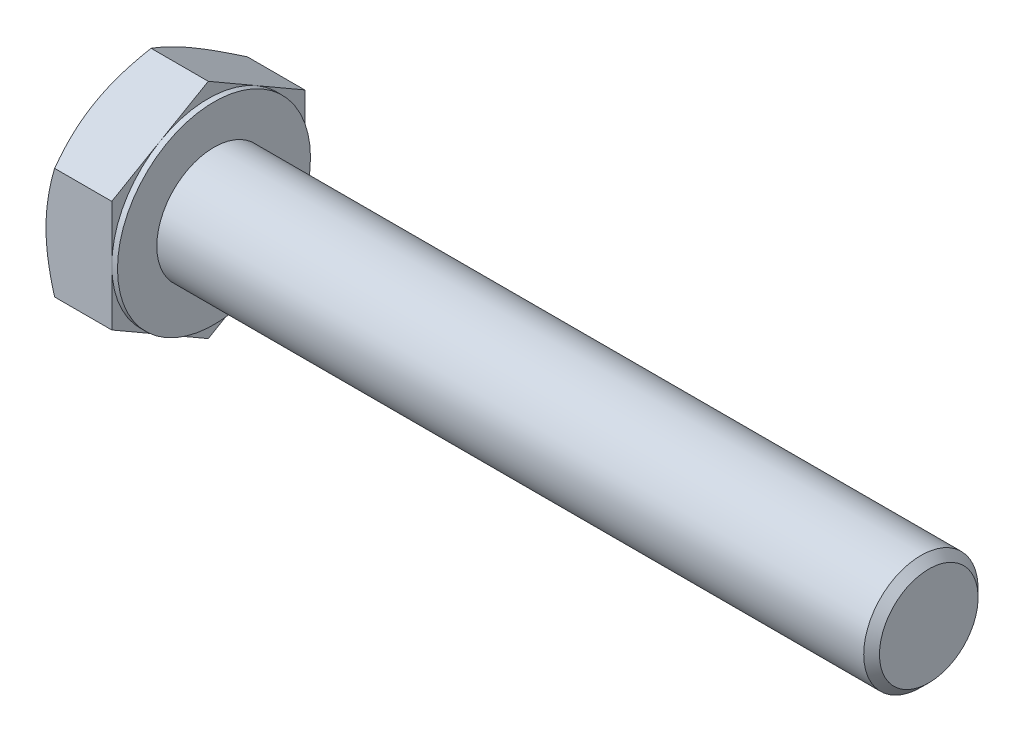
ISO-10303-21;
HEADER;
FILE_DESCRIPTION(('STEP AP214'),'2;1');
FILE_NAME('part.step','',(''),(''),'','','');
FILE_SCHEMA(('AUTOMOTIVE_DESIGN { 1 0 10303 214 1 1 1 1 }'));
ENDSEC;
DATA;
#1=APPLICATION_CONTEXT('core data for automotive mechanical design processes');
#2=APPLICATION_PROTOCOL_DEFINITION('international standard','automotive_design',2000,#1);
#3=PRODUCT_CONTEXT('',#1,'mechanical');
#4=PRODUCT('Part','Part','',(#3));
#5=PRODUCT_RELATED_PRODUCT_CATEGORY('part','',(#4));
#6=PRODUCT_DEFINITION_FORMATION('','',#4);
#7=PRODUCT_DEFINITION_CONTEXT('part definition',#1,'design');
#8=PRODUCT_DEFINITION('design','',#6,#7);
#9=PRODUCT_DEFINITION_SHAPE('','',#8);
#10=(LENGTH_UNIT() NAMED_UNIT(*) SI_UNIT(.MILLI.,.METRE.));
#11=(NAMED_UNIT(*) PLANE_ANGLE_UNIT() SI_UNIT($,.RADIAN.));
#12=(NAMED_UNIT(*) SI_UNIT($,.STERADIAN.) SOLID_ANGLE_UNIT());
#13=UNCERTAINTY_MEASURE_WITH_UNIT(LENGTH_MEASURE(1.E-05),#10,'distance_accuracy_value','');
#14=(GEOMETRIC_REPRESENTATION_CONTEXT(3) GLOBAL_UNCERTAINTY_ASSIGNED_CONTEXT((#13)) GLOBAL_UNIT_ASSIGNED_CONTEXT((#10,
#11,#12)) REPRESENTATION_CONTEXT('',''));
#15=CARTESIAN_POINT('',(0.,0.,0.));
#16=DIRECTION('',(0.,0.,1.));
#17=DIRECTION('',(1.,0.,0.));
#18=AXIS2_PLACEMENT_3D('',#15,#16,#17);
#19=CARTESIAN_POINT('',(10.,15.5884572681199,0.));
#20=DIRECTION('',(1.,0.,0.));
#21=DIRECTION('',(0.,0.,-1.));
#22=AXIS2_PLACEMENT_3D('',#19,#20,#21);
#23=PLANE('',#22);
#24=CARTESIAN_POINT('',(10.,0.,0.));
#25=DIRECTION('',(1.,0.,0.));
#26=DIRECTION('',(0.,0.,-1.));
#27=AXIS2_PLACEMENT_3D('',#24,#25,#26);
#28=CIRCLE('',#27,8.);
#29=CARTESIAN_POINT('',(10.,0.,-8.));
#30=VERTEX_POINT('',#29);
#31=EDGE_CURVE('E273',#30,#30,#28,.F.);
#32=ORIENTED_EDGE('',*,*,#31,.T.);
#33=EDGE_LOOP('',(#32));
#34=FACE_BOUND('',#33,.T.);
#35=CARTESIAN_POINT('',(10.,0.,0.));
#36=DIRECTION('',(1.,0.,0.));
#37=DIRECTION('',(0.,0.,-1.));
#38=AXIS2_PLACEMENT_3D('',#35,#36,#37);
#39=CIRCLE('',#38,13.5);
#40=CARTESIAN_POINT('',(10.,0.,-13.5));
#41=VERTEX_POINT('',#40);
#42=EDGE_CURVE('E292',#41,#41,#39,.T.);
#43=ORIENTED_EDGE('',*,*,#42,.T.);
#44=EDGE_LOOP('',(#43));
#45=FACE_BOUND('',#44,.T.);
#46=ADVANCED_FACE('F35',(#34,#45),#23,.T.);
#47=CARTESIAN_POINT('',(0.,0.,0.));
#48=DIRECTION('',(-1.,0.,0.));
#49=DIRECTION('',(0.,0.,1.));
#50=AXIS2_PLACEMENT_3D('',#47,#48,#49);
#51=CYLINDRICAL_SURFACE('',#50,8.);
#52=ORIENTED_EDGE('',*,*,#31,.F.);
#53=EDGE_LOOP('',(#52));
#54=FACE_BOUND('',#53,.T.);
#55=CARTESIAN_POINT('',(108.8985,0.,0.));
#56=DIRECTION('',(-1.,0.,0.));
#57=DIRECTION('',(0.,0.,1.));
#58=AXIS2_PLACEMENT_3D('',#55,#56,#57);
#59=CIRCLE('',#58,8.);
#60=CARTESIAN_POINT('',(108.8985,0.,8.));
#61=VERTEX_POINT('',#60);
#62=EDGE_CURVE('E270',#61,#61,#59,.T.);
#63=ORIENTED_EDGE('',*,*,#62,.T.);
#64=EDGE_LOOP('',(#63));
#65=FACE_BOUND('',#64,.T.);
#66=ADVANCED_FACE('F244',(#54,#65),#51,.T.);
#67=CARTESIAN_POINT('',(110.,0.,0.));
#68=DIRECTION('',(-1.,0.,0.));
#69=DIRECTION('',(0.,0.,1.));
#70=AXIS2_PLACEMENT_3D('',#67,#68,#69);
#71=CONICAL_SURFACE('',#70,6.8985,0.785398163397433);
#72=ORIENTED_EDGE('',*,*,#62,.F.);
#73=EDGE_LOOP('',(#72));
#74=FACE_BOUND('',#73,.T.);
#75=CARTESIAN_POINT('',(110.,0.,0.));
#76=DIRECTION('',(-1.,0.,0.));
#77=DIRECTION('',(0.,0.,1.));
#78=AXIS2_PLACEMENT_3D('',#75,#76,#77);
#79=CIRCLE('',#78,6.8985);
#80=CARTESIAN_POINT('',(110.,0.,6.8985));
#81=VERTEX_POINT('',#80);
#82=EDGE_CURVE('E268',#81,#81,#79,.T.);
#83=ORIENTED_EDGE('',*,*,#82,.T.);
#84=EDGE_LOOP('',(#83));
#85=FACE_BOUND('',#84,.T.);
#86=ADVANCED_FACE('F249',(#74,#85),#71,.T.);
#87=CARTESIAN_POINT('',(110.,0.,0.));
#88=DIRECTION('',(-1.,0.,0.));
#89=DIRECTION('',(0.,0.,1.));
#90=AXIS2_PLACEMENT_3D('',#87,#88,#89);
#91=PLANE('',#90);
#92=ORIENTED_EDGE('',*,*,#82,.F.);
#93=EDGE_LOOP('',(#92));
#94=FACE_BOUND('',#93,.T.);
#95=ADVANCED_FACE('F256',(#94),#91,.F.);
#96=CARTESIAN_POINT('',(9.2,13.5,0.));
#97=DIRECTION('',(1.,0.,0.));
#98=DIRECTION('',(0.,0.,-1.));
#99=AXIS2_PLACEMENT_3D('',#96,#97,#98);
#100=PLANE('',#99);
#101=DIRECTION('',(0.,0.500000000000001,0.866025403784438));
#102=VECTOR('',#101,1.);
#103=CARTESIAN_POINT('',(9.2,7.79422863405993,-13.5));
#104=LINE('',#103,#102);
#105=CARTESIAN_POINT('',(9.2,7.79422863405993,-13.5));
#106=VERTEX_POINT('',#105);
#107=CARTESIAN_POINT('',(9.2,11.6913429510899,-6.75000000000002));
#108=VERTEX_POINT('',#107);
#109=EDGE_CURVE('E168',#106,#108,#104,.T.);
#110=ORIENTED_EDGE('',*,*,#109,.T.);
#111=CARTESIAN_POINT('',(9.2,0.,0.));
#112=DIRECTION('',(-1.,0.,0.));
#113=DIRECTION('',(0.,0.,1.));
#114=AXIS2_PLACEMENT_3D('',#111,#112,#113);
#115=CIRCLE('',#114,13.5);
#116=CARTESIAN_POINT('',(9.2,0.,-13.5));
#117=VERTEX_POINT('',#116);
#118=EDGE_CURVE('E51',#108,#117,#115,.T.);
#119=ORIENTED_EDGE('',*,*,#118,.T.);
#120=DIRECTION('',(0.,1.,0.));
#121=VECTOR('',#120,1.);
#122=CARTESIAN_POINT('',(9.2,7.79422863405993,-13.5));
#123=LINE('',#122,#121);
#124=EDGE_CURVE('E40',#117,#106,#123,.T.);
#125=ORIENTED_EDGE('',*,*,#124,.T.);
#126=EDGE_LOOP('',(#110,#119,#125));
#127=FACE_BOUND('',#126,.T.);
#128=ADVANCED_FACE('F259',(#127),#100,.T.);
#129=CARTESIAN_POINT('',(9.2,15.5884572681199,0.));
#130=VERTEX_POINT('',#129);
#131=EDGE_CURVE('E166',#108,#130,#104,.T.);
#132=ORIENTED_EDGE('',*,*,#131,.T.);
#133=DIRECTION('',(0.,-0.500000000000001,0.866025403784438));
#134=VECTOR('',#133,1.);
#135=CARTESIAN_POINT('',(9.2,15.5884572681199,0.));
#136=LINE('',#135,#134);
#137=CARTESIAN_POINT('',(9.2,11.6913429510899,6.75000000000001));
#138=VERTEX_POINT('',#137);
#139=EDGE_CURVE('E165',#130,#138,#136,.T.);
#140=ORIENTED_EDGE('',*,*,#139,.T.);
#141=EDGE_CURVE('E154',#138,#108,#115,.T.);
#142=ORIENTED_EDGE('',*,*,#141,.T.);
#143=EDGE_LOOP('',(#132,#140,#142));
#144=FACE_BOUND('',#143,.T.);
#145=ADVANCED_FACE('F264',(#144),#100,.T.);
#146=CARTESIAN_POINT('',(9.2,7.79422863405994,13.5));
#147=VERTEX_POINT('',#146);
#148=EDGE_CURVE('E133',#138,#147,#136,.T.);
#149=ORIENTED_EDGE('',*,*,#148,.T.);
#150=DIRECTION('',(0.,-1.,0.));
#151=VECTOR('',#150,1.);
#152=CARTESIAN_POINT('',(9.2,7.79422863405994,13.5));
#153=LINE('',#152,#151);
#154=CARTESIAN_POINT('',(9.2,0.,13.5));
#155=VERTEX_POINT('',#154);
#156=EDGE_CURVE('E127',#147,#155,#153,.T.);
#157=ORIENTED_EDGE('',*,*,#156,.T.);
#158=EDGE_CURVE('E131',#155,#138,#115,.T.);
#159=ORIENTED_EDGE('',*,*,#158,.T.);
#160=EDGE_LOOP('',(#149,#157,#159));
#161=FACE_BOUND('',#160,.T.);
#162=ADVANCED_FACE('F129',(#161),#100,.T.);
#163=CARTESIAN_POINT('',(9.2,-7.79422863405994,13.5));
#164=VERTEX_POINT('',#163);
#165=EDGE_CURVE('E137',#155,#164,#153,.T.);
#166=ORIENTED_EDGE('',*,*,#165,.T.);
#167=DIRECTION('',(0.,-0.500000000000002,-0.866025403784438));
#168=VECTOR('',#167,1.);
#169=CARTESIAN_POINT('',(9.2,-15.5884572681199,0.));
#170=LINE('',#169,#168);
#171=CARTESIAN_POINT('',(9.2,-11.6913429510899,6.75000000000003));
#172=VERTEX_POINT('',#171);
#173=EDGE_CURVE('E144',#164,#172,#170,.T.);
#174=ORIENTED_EDGE('',*,*,#173,.T.);
#175=EDGE_CURVE('E141',#172,#155,#115,.T.);
#176=ORIENTED_EDGE('',*,*,#175,.T.);
#177=EDGE_LOOP('',(#166,#174,#176));
#178=FACE_BOUND('',#177,.T.);
#179=ADVANCED_FACE('F142',(#178),#100,.T.);
#180=CARTESIAN_POINT('',(9.2,-15.5884572681199,0.));
#181=VERTEX_POINT('',#180);
#182=EDGE_CURVE('E160',#172,#181,#170,.T.);
#183=ORIENTED_EDGE('',*,*,#182,.T.);
#184=DIRECTION('',(0.,0.500000000000001,-0.866025403784438));
#185=VECTOR('',#184,1.);
#186=CARTESIAN_POINT('',(9.2,-7.79422863405997,-13.5));
#187=LINE('',#186,#185);
#188=CARTESIAN_POINT('',(9.2,-11.6913429510899,-6.75000000000001));
#189=VERTEX_POINT('',#188);
#190=EDGE_CURVE('E328',#181,#189,#187,.T.);
#191=ORIENTED_EDGE('',*,*,#190,.T.);
#192=EDGE_CURVE('E148',#189,#172,#115,.T.);
#193=ORIENTED_EDGE('',*,*,#192,.T.);
#194=EDGE_LOOP('',(#183,#191,#193));
#195=FACE_BOUND('',#194,.T.);
#196=ADVANCED_FACE('F333',(#195),#100,.T.);
#197=CARTESIAN_POINT('',(9.2,-7.79422863405997,-13.5));
#198=VERTEX_POINT('',#197);
#199=EDGE_CURVE('E155',#189,#198,#187,.T.);
#200=ORIENTED_EDGE('',*,*,#199,.T.);
#201=EDGE_CURVE('E11',#198,#117,#123,.T.);
#202=ORIENTED_EDGE('',*,*,#201,.T.);
#203=EDGE_CURVE('E346',#117,#189,#115,.T.);
#204=ORIENTED_EDGE('',*,*,#203,.T.);
#205=EDGE_LOOP('',(#200,#202,#204));
#206=FACE_BOUND('',#205,.T.);
#207=ADVANCED_FACE('F265',(#206),#100,.T.);
#208=CARTESIAN_POINT('',(0.,0.,0.));
#209=DIRECTION('',(-1.,0.,0.));
#210=DIRECTION('',(0.,0.,1.));
#211=AXIS2_PLACEMENT_3D('',#208,#209,#210);
#212=CYLINDRICAL_SURFACE('',#211,13.5);
#213=ORIENTED_EDGE('',*,*,#118,.F.);
#214=ORIENTED_EDGE('',*,*,#141,.F.);
#215=ORIENTED_EDGE('',*,*,#158,.F.);
#216=ORIENTED_EDGE('',*,*,#175,.F.);
#217=ORIENTED_EDGE('',*,*,#192,.F.);
#218=ORIENTED_EDGE('',*,*,#203,.F.);
#219=EDGE_LOOP('',(#213,#214,#215,#216,#217,#218));
#220=FACE_BOUND('',#219,.T.);
#221=ORIENTED_EDGE('',*,*,#42,.F.);
#222=EDGE_LOOP('',(#221));
#223=FACE_BOUND('',#222,.T.);
#224=ADVANCED_FACE('F151',(#220,#223),#212,.T.);
#225=CARTESIAN_POINT('',(0.,15.5884572681199,0.));
#226=DIRECTION('',(1.,0.,0.));
#227=DIRECTION('',(0.,0.,-1.));
#228=AXIS2_PLACEMENT_3D('',#225,#226,#227);
#229=PLANE('',#228);
#230=CARTESIAN_POINT('',(0.,0.,0.));
#231=DIRECTION('',(1.,0.,0.));
#232=DIRECTION('',(0.,0.,-1.));
#233=AXIS2_PLACEMENT_3D('',#230,#231,#232);
#234=CIRCLE('',#233,13.5);
#235=CARTESIAN_POINT('',(0.,0.,-13.5));
#236=VERTEX_POINT('',#235);
#237=CARTESIAN_POINT('',(0.,11.6913429510899,-6.75000000000002));
#238=VERTEX_POINT('',#237);
#239=EDGE_CURVE('E291',#236,#238,#234,.T.);
#240=ORIENTED_EDGE('',*,*,#239,.F.);
#241=CARTESIAN_POINT('',(0.,-11.6913429510899,-6.75000000000001));
#242=VERTEX_POINT('',#241);
#243=EDGE_CURVE('E288',#242,#236,#234,.T.);
#244=ORIENTED_EDGE('',*,*,#243,.F.);
#245=CARTESIAN_POINT('',(0.,-11.6913429510899,6.75000000000002));
#246=VERTEX_POINT('',#245);
#247=EDGE_CURVE('E290',#246,#242,#234,.T.);
#248=ORIENTED_EDGE('',*,*,#247,.F.);
#249=CARTESIAN_POINT('',(0.,0.,13.5));
#250=VERTEX_POINT('',#249);
#251=EDGE_CURVE('E300',#250,#246,#234,.T.);
#252=ORIENTED_EDGE('',*,*,#251,.F.);
#253=CARTESIAN_POINT('',(0.,0.,0.));
#254=DIRECTION('',(-1.,0.,0.));
#255=DIRECTION('',(0.,0.,1.));
#256=AXIS2_PLACEMENT_3D('',#253,#254,#255);
#257=CIRCLE('',#256,13.5);
#258=CARTESIAN_POINT('',(0.,11.6913429510899,6.75000000000001));
#259=VERTEX_POINT('',#258);
#260=EDGE_CURVE('E169',#250,#259,#257,.T.);
#261=ORIENTED_EDGE('',*,*,#260,.T.);
#262=EDGE_CURVE('E295',#238,#259,#234,.T.);
#263=ORIENTED_EDGE('',*,*,#262,.F.);
#264=EDGE_LOOP('',(#240,#244,#248,#252,#261,#263));
#265=FACE_BOUND('',#264,.T.);
#266=ADVANCED_FACE('F198',(#265),#229,.F.);
#267=CARTESIAN_POINT('',(0.,0.,0.));
#268=DIRECTION('',(1.,0.,0.));
#269=DIRECTION('',(0.,0.,-1.));
#270=AXIS2_PLACEMENT_3D('',#267,#268,#269);
#271=CONICAL_SURFACE('',#270,13.5,1.0471975511966);
#272=CARTESIAN_POINT('',(1.20583803334744,7.7941131640061,13.5002));
#273=CARTESIAN_POINT('',(1.10693600185288,7.96542734310489,13.2034751377439));
#274=CARTESIAN_POINT('',(1.01252193890574,8.13740973961965,12.9055928889729));
#275=CARTESIAN_POINT('',(0.833917254878249,8.48275363037183,12.3074397241066));
#276=CARTESIAN_POINT('',(0.749729996263837,8.65611555833004,12.0071680567849));
#277=CARTESIAN_POINT('',(0.592710566835617,9.00455355753,11.403655738883));
#278=CARTESIAN_POINT('',(0.51990526259524,9.17963267786846,11.1004098071123));
#279=CARTESIAN_POINT('',(0.387213084407287,9.53100751002426,10.4918107453174));
#280=CARTESIAN_POINT('',(0.327325473477572,9.7073031518439,10.1864577365329));
#281=CARTESIAN_POINT('',(0.223015910639062,10.0565936504728,9.58146884630662));
#282=CARTESIAN_POINT('',(0.17824871362455,10.2295625754616,9.28187788009544));
#283=CARTESIAN_POINT('',(0.103183935683262,10.5762930076628,8.68132315499258));
#284=CARTESIAN_POINT('',(0.0728866332670118,10.7500545300658,8.38035936979001));
#285=CARTESIAN_POINT('',(0.0275266341970793,11.0978694745929,7.77792621423743));
#286=CARTESIAN_POINT('',(0.0124458340286923,11.2719223024903,7.47645787311809));
#287=CARTESIAN_POINT('',(-0.00215683633239847,11.6201886315474,6.87324289662571));
#288=CARTESIAN_POINT('',(-0.00167918727246797,11.7944021275762,6.57149627013964));
#289=CARTESIAN_POINT('',(0.0137483336445674,12.1200937136619,6.00738189544142));
#290=CARTESIAN_POINT('',(0.0268164189930316,12.271595012447,5.74497394853304));
#291=CARTESIAN_POINT('',(0.0644725699586012,12.5742491226741,5.22076165250011));
#292=CARTESIAN_POINT('',(0.0890614504269867,12.7254019087062,4.95895734738682));
#293=CARTESIAN_POINT('',(0.149330465436024,13.0272768920407,4.43609453871756));
#294=CARTESIAN_POINT('',(0.185019760507138,13.1779986295677,4.17503683151571));
#295=CARTESIAN_POINT('',(0.266863438712335,13.4787354904687,3.65414530872634));
#296=CARTESIAN_POINT('',(0.313018533291661,13.6287505650972,3.39431157756869));
#297=CARTESIAN_POINT('',(0.468349259272658,14.0841296870377,2.60557180166152));
#298=CARTESIAN_POINT('',(0.59301303342539,14.3881750256073,2.07894982745447));
#299=CARTESIAN_POINT('',(0.875948867571987,14.9917319951217,1.03355849099334));
#300=CARTESIAN_POINT('',(1.0341544783732,15.2912513537195,0.514775744051519));
#301=CARTESIAN_POINT('',(1.20583803334745,15.5885727381737,-0.000199999999998265));
#302=B_SPLINE_CURVE_WITH_KNOTS('',3,(#272,#273,#274,#275,#276,#277,#278,#279,#280,#281,#282,
#283,#284,#285,#286,#287,#288,#289,#290,#291,#292,#293,#294,#295,#296,#297,#298,#299,#300,#301),
.UNSPECIFIED.,.F.,.F.,(4,2,2,2,2,2,2,2,2,2,2,2,2,2,4),(0.,1.0698794936454,2.14010980578041,
3.21282939735429,4.28548777177525,5.33167033690336,6.37787303770781,7.42282956789443,
8.46775380954026,9.37738732544599,10.2870851882952,11.1975357730373,12.1080482670512,
13.9691139233208,15.8265265395635),.UNSPECIFIED.);
#303=CARTESIAN_POINT('',(1.20577136594005,15.5884572681199,0.));
#304=VERTEX_POINT('',#303);
#305=EDGE_CURVE('E216',#259,#304,#302,.T.);
#306=ORIENTED_EDGE('',*,*,#305,.T.);
#307=CARTESIAN_POINT('',(1.20583803334745,15.5885727381737,0.0002));
#308=CARTESIAN_POINT('',(1.10693600185289,15.417258559075,-0.296524862256054));
#309=CARTESIAN_POINT('',(1.01252193890575,15.2452761625602,-0.594407111027072));
#310=CARTESIAN_POINT('',(0.833917254878256,14.899932271808,-1.19256027589336));
#311=CARTESIAN_POINT('',(0.749729996263842,14.7265703438498,-1.49283194321508));
#312=CARTESIAN_POINT('',(0.592710566835621,14.3781323446498,-2.09634426111705));
#313=CARTESIAN_POINT('',(0.519905262595244,14.2030532243114,-2.39959019288773));
#314=CARTESIAN_POINT('',(0.38721308440729,13.8516783921556,-3.00818925468256));
#315=CARTESIAN_POINT('',(0.327325473477575,13.6753827503359,-3.31354226346714));
#316=CARTESIAN_POINT('',(0.223015910639064,13.3260922517071,-3.91853115369338));
#317=CARTESIAN_POINT('',(0.178248713624552,13.1531233267183,-4.21812211990455));
#318=CARTESIAN_POINT('',(0.103183935683263,12.8063928945171,-4.81867684500741));
#319=CARTESIAN_POINT('',(0.0728866332670115,12.632631372114,-5.11964063020999));
#320=CARTESIAN_POINT('',(0.0275266341970785,12.284816427587,-5.72207378576257));
#321=CARTESIAN_POINT('',(0.0124458340286916,12.1107635996896,-6.02354212688191));
#322=CARTESIAN_POINT('',(-0.00215683633240033,11.7624972706325,-6.62675710337429));
#323=CARTESIAN_POINT('',(-0.00167918727247124,11.5882837746037,-6.92850372986036));
#324=CARTESIAN_POINT('',(0.0137483336445631,11.2625921885179,-7.49261810455858));
#325=CARTESIAN_POINT('',(0.0268164189930275,11.1110908897329,-7.75502605146696));
#326=CARTESIAN_POINT('',(0.0644725699585969,10.8084367795058,-8.27923834749989));
#327=CARTESIAN_POINT('',(0.0890614504269819,10.6572839934736,-8.54104265261318));
#328=CARTESIAN_POINT('',(0.149330465436018,10.3554090101392,-9.06390546128244));
#329=CARTESIAN_POINT('',(0.185019760507132,10.2046872726121,-9.32496316848429));
#330=CARTESIAN_POINT('',(0.266863438712328,9.9039504117111,-9.84585469127366));
#331=CARTESIAN_POINT('',(0.313018533291655,9.75393533708269,-10.1056884224313));
#332=CARTESIAN_POINT('',(0.468349259272652,9.29855621514212,-10.8944281983385));
#333=CARTESIAN_POINT('',(0.593013033425382,8.9945108765725,-11.4210501725455));
#334=CARTESIAN_POINT('',(0.875948867571977,8.39095390705816,-12.4664415090067));
#335=CARTESIAN_POINT('',(1.03415447837319,8.09143454846036,-12.9852242559485));
#336=CARTESIAN_POINT('',(1.20583803334744,7.79411316400609,-13.5002));
#337=B_SPLINE_CURVE_WITH_KNOTS('',3,(#307,#308,#309,#310,#311,#312,#313,#314,#315,#316,#317,
#318,#319,#320,#321,#322,#323,#324,#325,#326,#327,#328,#329,#330,#331,#332,#333,#334,#335,#336),
.UNSPECIFIED.,.F.,.F.,(4,2,2,2,2,2,2,2,2,2,2,2,2,2,4),(0.,1.0698794936454,2.14010980578041,
3.21282939735429,4.28548777177525,5.33167033690336,6.37787303770781,7.42282956789444,
8.46775380954027,9.377387325446,10.2870851882952,11.1975357730374,12.1080482670513,
13.9691139233208,15.8265265395635),.UNSPECIFIED.);
#338=EDGE_CURVE('E59',#304,#238,#337,.T.);
#339=ORIENTED_EDGE('',*,*,#338,.T.);
#340=ORIENTED_EDGE('',*,*,#262,.T.);
#341=EDGE_LOOP('',(#306,#339,#340));
#342=FACE_BOUND('',#341,.T.);
#343=ADVANCED_FACE('F342',(#342),#271,.T.);
#344=CARTESIAN_POINT('',(6.65552250495166,-21.0745325912131,13.5));
#345=CARTESIAN_POINT('',(6.5119213196538,-20.7791464058322,13.5));
#346=CARTESIAN_POINT('',(6.3690258053421,-20.4834173215818,13.5));
#347=CARTESIAN_POINT('',(6.08480566588022,-19.891201849661,13.5));
#348=CARTESIAN_POINT('',(5.9434810561073,-19.5947154546124,13.5));
#349=CARTESIAN_POINT('',(5.52206654710979,-18.7039359898516,13.5));
#350=CARTESIAN_POINT('',(5.24457752621021,-18.1084078939184,13.5));
#351=CARTESIAN_POINT('',(4.69672238464205,-16.9102372700575,13.5));
#352=CARTESIAN_POINT('',(4.42640208158634,-16.3075737428368,13.5));
#353=CARTESIAN_POINT('',(3.89663579850197,-15.0975022908283,13.5));
#354=CARTESIAN_POINT('',(3.63718931395402,-14.4900945877136,13.5));
#355=CARTESIAN_POINT('',(3.12369893947335,-13.2494069073504,13.5));
#356=CARTESIAN_POINT('',(2.8701164550237,-12.6159349800556,13.5));
#357=CARTESIAN_POINT('',(2.38180982352807,-11.3416266475287,13.5));
#358=CARTESIAN_POINT('',(2.14708777368623,-10.7007894323374,13.5));
#359=CARTESIAN_POINT('',(1.70256667973608,-9.41190712282995,13.5));
#360=CARTESIAN_POINT('',(1.49271834821402,-8.76387916273799,13.5));
#361=CARTESIAN_POINT('',(1.10457449552645,-7.45846720315997,13.5));
#362=CARTESIAN_POINT('',(0.926269180857156,-6.80108617635228,13.5));
#363=CARTESIAN_POINT('',(0.689343391492074,-5.80970729773043,13.5));
#364=CARTESIAN_POINT('',(0.615621316462391,-5.47929754824038,13.5));
#365=CARTESIAN_POINT('',(0.479218121726768,-4.81619500784243,13.5));
#366=CARTESIAN_POINT('',(0.416536782037618,-4.48350226255976,13.5));
#367=CARTESIAN_POINT('',(0.303312809434867,-3.81605303016929,13.5));
#368=CARTESIAN_POINT('',(0.252769967446792,-3.48129657870881,13.5));
#369=CARTESIAN_POINT('',(0.164825873705821,-2.8100632435211,13.5));
#370=CARTESIAN_POINT('',(0.127424101516909,-2.47358642846234,13.5));
#371=CARTESIAN_POINT('',(0.0669819137111105,-1.80383571610776,13.5));
#372=CARTESIAN_POINT('',(0.0437576325332615,-1.47057851441347,13.5));
#373=CARTESIAN_POINT('',(0.0114301437540811,-0.803380769868857,13.5));
#374=CARTESIAN_POINT('',(0.00232669798564708,-0.469440238638946,13.5));
#375=CARTESIAN_POINT('',(-0.00154201275903892,0.198526894640142,13.5));
#376=CARTESIAN_POINT('',(0.00369274805279489,0.532553496843042,13.5));
#377=CARTESIAN_POINT('',(0.0283710664469002,1.2000851507397,13.5));
#378=CARTESIAN_POINT('',(0.0478152523229275,1.53359017871768,13.5));
#379=CARTESIAN_POINT('',(0.110874417403469,2.33095876873586,13.5));
#380=CARTESIAN_POINT('',(0.161000567994547,2.79431674635738,13.5));
#381=CARTESIAN_POINT('',(0.285984098802108,3.71768710859737,13.5));
#382=CARTESIAN_POINT('',(0.360844727080062,4.17769904571074,13.5));
#383=CARTESIAN_POINT('',(0.53263439097848,5.093907146853,13.5));
#384=CARTESIAN_POINT('',(0.62958022331539,5.55010013120955,13.5));
#385=CARTESIAN_POINT('',(0.842574156780341,6.45795589096169,13.5));
#386=CARTESIAN_POINT('',(0.958622001211247,6.90961872714792,13.5));
#387=CARTESIAN_POINT('',(1.20975308172247,7.81842814998754,13.5));
#388=CARTESIAN_POINT('',(1.34520276420359,8.27547276919521,13.5));
#389=CARTESIAN_POINT('',(1.63037567165068,9.18506172599708,13.5));
#390=CARTESIAN_POINT('',(1.78009899260467,9.63760603330478,13.5));
#391=CARTESIAN_POINT('',(2.09141761032544,10.5384131278266,13.5));
#392=CARTESIAN_POINT('',(2.25300914829631,10.986677220241,13.5));
#393=CARTESIAN_POINT('',(2.58613586655752,11.8794725453459,13.5));
#394=CARTESIAN_POINT('',(2.75767091863969,12.3240038260815,13.5));
#395=CARTESIAN_POINT('',(3.18025624760456,13.3892782836475,13.5));
#396=CARTESIAN_POINT('',(3.43535483887552,14.0084132883588,13.5));
#397=CARTESIAN_POINT('',(3.95837880975389,15.2412584701716,13.5));
#398=CARTESIAN_POINT('',(4.22630505867306,15.8549682762671,13.5));
#399=CARTESIAN_POINT('',(4.77236357831712,17.0779981981639,13.5));
#400=CARTESIAN_POINT('',(5.05049833311979,17.6873172017998,13.5));
#401=CARTESIAN_POINT('',(5.6148702751147,18.9021637926335,13.5));
#402=CARTESIAN_POINT('',(5.90110727081901,19.5076914690229,13.5));
#403=CARTESIAN_POINT('',(6.48047787553089,20.7163040814209,13.5));
#404=CARTESIAN_POINT('',(6.77361916133141,21.3193853307735,13.5));
#405=CARTESIAN_POINT('',(7.36527607850463,22.5229054555965,13.5));
#406=CARTESIAN_POINT('',(7.66379173547757,23.1233443184633,13.5));
#407=CARTESIAN_POINT('',(8.26521723033142,24.3219086940862,13.5));
#408=CARTESIAN_POINT('',(8.56812644134661,24.9200345217343,13.5));
#409=CARTESIAN_POINT('',(9.17764891450146,26.1143969327798,13.5));
#410=CARTESIAN_POINT('',(9.48426219155985,26.7106335085557,13.5));
#411=CARTESIAN_POINT('',(10.3554001639816,28.3938429255261,13.5));
#412=CARTESIAN_POINT('',(10.9235502093501,29.4789393963536,13.5));
#413=CARTESIAN_POINT('',(12.0675588478843,31.6451050831007,13.5));
#414=CARTESIAN_POINT('',(12.6434177389315,32.7261741413195,13.5));
#415=CARTESIAN_POINT('',(13.7994904405044,34.8823093902718,13.5));
#416=CARTESIAN_POINT('',(14.3796887590139,35.9573838932129,13.5));
#417=CARTESIAN_POINT('',(15.2533946206875,37.5681041358021,13.5));
#418=CARTESIAN_POINT('',(15.5451895383682,38.1046802403169,13.5));
#419=CARTESIAN_POINT('',(16.129801129039,39.1772745244478,13.5));
#420=CARTESIAN_POINT('',(16.4226178004543,39.7132927049222,13.5));
#421=CARTESIAN_POINT('',(16.71588588851,40.2490638615173,13.5));
#422=B_SPLINE_CURVE_WITH_KNOTS('',3,(#344,#345,#346,#347,#348,#349,#350,#351,#352,#353,#354,
#355,#356,#357,#358,#359,#360,#361,#362,#363,#364,#365,#366,#367,#368,#369,#370,#371,#372,#373,
#374,#375,#376,#377,#378,#379,#380,#381,#382,#383,#384,#385,#386,#387,#388,#389,#390,#391,#392,
#393,#394,#395,#396,#397,#398,#399,#400,#401,#402,#403,#404,#405,#406,#407,#408,#409,#410,#411,
#412,#413,#414,#415,#416,#417,#418,#419,#420,#421),.UNSPECIFIED.,.F.,.F.,(4,2,2,2,2,2,2,2,2,2,2,
2,2,2,2,2,2,2,2,2,2,2,2,2,2,2,2,2,2,2,2,2,2,2,2,2,2,2,4),(0.,0.98532495112201,1.97065953889851,
3.94161322800506,5.92306611644916,7.90442696819132,9.95122396090017,11.9982482351106,
14.0411459982621,16.0834083632248,17.0988569842376,18.1142853704641,19.1296962656147,
20.1450669421231,21.1469730260158,22.1488622112154,23.1507531983712,24.1526884885118,
25.550102612193,26.947700313315,28.3463645153709,29.7450099233969,31.1748114857401,
32.6046226639565,34.0339829417775,35.463324794027,37.4720142115936,39.4808399483455,
41.4901577845392,43.4994281722061,45.5110492723814,47.5226799572338,49.5340263951321,
51.5453809367633,55.2198486699729,58.8944588024731,62.5593771469718,64.391731018899,
66.2240820679583),.UNSPECIFIED.);
#423=CARTESIAN_POINT('',(1.20577136594004,7.79422863405994,13.5));
#424=VERTEX_POINT('',#423);
#425=EDGE_CURVE('E228',#250,#424,#422,.T.);
#426=ORIENTED_EDGE('',*,*,#425,.T.);
#427=EDGE_CURVE('E227',#424,#259,#302,.T.);
#428=ORIENTED_EDGE('',*,*,#427,.T.);
#429=ORIENTED_EDGE('',*,*,#260,.F.);
#430=EDGE_LOOP('',(#426,#428,#429));
#431=FACE_BOUND('',#430,.T.);
#432=ADVANCED_FACE('F338',(#431),#271,.T.);
#433=CARTESIAN_POINT('',(1.20577136594004,-7.79422863405994,13.5));
#434=VERTEX_POINT('',#433);
#435=EDGE_CURVE('E271',#434,#250,#422,.T.);
#436=ORIENTED_EDGE('',*,*,#435,.T.);
#437=ORIENTED_EDGE('',*,*,#251,.T.);
#438=CARTESIAN_POINT('',(1.20583803334746,-15.5885727381738,-0.000200000000000067));
#439=CARTESIAN_POINT('',(1.1069360018529,-15.417258559075,0.296524862256054));
#440=CARTESIAN_POINT('',(1.01252193890576,-15.2452761625602,0.594407111027073));
#441=CARTESIAN_POINT('',(0.833917254878267,-14.899932271808,1.19256027589336));
#442=CARTESIAN_POINT('',(0.749729996263854,-14.7265703438498,1.49283194321508));
#443=CARTESIAN_POINT('',(0.592710566835633,-14.3781323446499,2.09634426111705));
#444=CARTESIAN_POINT('',(0.519905262595255,-14.2030532243114,2.39959019288773));
#445=CARTESIAN_POINT('',(0.3872130844073,-13.8516783921556,3.00818925468256));
#446=CARTESIAN_POINT('',(0.327325473477584,-13.675382750336,3.31354226346714));
#447=CARTESIAN_POINT('',(0.223015910639073,-13.3260922517071,3.91853115369338));
#448=CARTESIAN_POINT('',(0.178248713624561,-13.1531233267183,4.21812211990456));
#449=CARTESIAN_POINT('',(0.103183935683272,-12.8063928945171,4.81867684500742));
#450=CARTESIAN_POINT('',(0.0728866332670203,-12.632631372114,5.11964063021));
#451=CARTESIAN_POINT('',(0.0275266341970863,-12.284816427587,5.72207378576257));
#452=CARTESIAN_POINT('',(0.0124458340286988,-12.1107635996896,6.02354212688192));
#453=CARTESIAN_POINT('',(-0.00215683633239394,-11.7624972706325,6.62675710337429));
#454=CARTESIAN_POINT('',(-0.0016791872724649,-11.5882837746037,6.92850372986036));
#455=CARTESIAN_POINT('',(0.0137483336445693,-11.2625921885179,7.49261810455858));
#456=CARTESIAN_POINT('',(0.0268164189930336,-11.1110908897329,7.75502605146696));
#457=CARTESIAN_POINT('',(0.0644725699586028,-10.8084367795058,8.27923834749989));
#458=CARTESIAN_POINT('',(0.0890614504269877,-10.6572839934736,8.54104265261319));
#459=CARTESIAN_POINT('',(0.149330465436024,-10.3554090101392,9.06390546128244));
#460=CARTESIAN_POINT('',(0.185019760507138,-10.2046872726121,9.32496316848429));
#461=CARTESIAN_POINT('',(0.266863438712334,-9.90395041171111,9.84585469127366));
#462=CARTESIAN_POINT('',(0.31301853329166,-9.75393533708269,10.1056884224313));
#463=CARTESIAN_POINT('',(0.468349259272654,-9.29855621514212,10.8944281983385));
#464=CARTESIAN_POINT('',(0.593013033425385,-8.9945108765725,11.4210501725455));
#465=CARTESIAN_POINT('',(0.875948867571981,-8.39095390705817,12.4664415090067));
#466=CARTESIAN_POINT('',(1.0341544783732,-8.09143454846037,12.9852242559485));
#467=CARTESIAN_POINT('',(1.20583803334744,-7.7941131640061,13.5002));
#468=B_SPLINE_CURVE_WITH_KNOTS('',3,(#438,#439,#440,#441,#442,#443,#444,#445,#446,#447,#448,
#449,#450,#451,#452,#453,#454,#455,#456,#457,#458,#459,#460,#461,#462,#463,#464,#465,#466,#467),
.UNSPECIFIED.,.F.,.F.,(4,2,2,2,2,2,2,2,2,2,2,2,2,2,4),(0.,1.06987949364541,2.14010980578041,
3.21282939735429,4.28548777177526,5.33167033690337,6.37787303770782,7.42282956789445,
8.46775380954028,9.377387325446,10.2870851882952,11.1975357730374,12.1080482670513,
13.9691139233208,15.8265265395635),.UNSPECIFIED.);
#469=EDGE_CURVE('E218',#246,#434,#468,.T.);
#470=ORIENTED_EDGE('',*,*,#469,.T.);
#471=EDGE_LOOP('',(#436,#437,#470));
#472=FACE_BOUND('',#471,.T.);
#473=ADVANCED_FACE('F187',(#472),#271,.T.);
#474=CARTESIAN_POINT('',(1.20577136594006,-15.5884572681199,0.));
#475=VERTEX_POINT('',#474);
#476=EDGE_CURVE('E211',#475,#246,#468,.T.);
#477=ORIENTED_EDGE('',*,*,#476,.T.);
#478=ORIENTED_EDGE('',*,*,#247,.T.);
#479=CARTESIAN_POINT('',(1.20583803334745,-7.79411316400613,-13.5002));
#480=CARTESIAN_POINT('',(1.10693600185289,-7.96542734310492,-13.2034751377439));
#481=CARTESIAN_POINT('',(1.01252193890575,-8.13740973961967,-12.9055928889729));
#482=CARTESIAN_POINT('',(0.833917254878257,-8.48275363037185,-12.3074397241066));
#483=CARTESIAN_POINT('',(0.749729996263844,-8.65611555833007,-12.0071680567849));
#484=CARTESIAN_POINT('',(0.592710566835625,-9.00455355753002,-11.4036557388829));
#485=CARTESIAN_POINT('',(0.519905262595249,-9.17963267786848,-11.1004098071123));
#486=CARTESIAN_POINT('',(0.387213084407295,-9.53100751002428,-10.4918107453174));
#487=CARTESIAN_POINT('',(0.327325473477581,-9.70730315184392,-10.1864577365329));
#488=CARTESIAN_POINT('',(0.223015910639072,-10.0565936504728,-9.58146884630662));
#489=CARTESIAN_POINT('',(0.178248713624561,-10.2295625754616,-9.28187788009544));
#490=CARTESIAN_POINT('',(0.103183935683273,-10.5762930076628,-8.68132315499258));
#491=CARTESIAN_POINT('',(0.0728866332670213,-10.7500545300659,-8.38035936979));
#492=CARTESIAN_POINT('',(0.0275266341970889,-11.0978694745929,-7.77792621423743));
#493=CARTESIAN_POINT('',(0.0124458340287029,-11.2719223024903,-7.47645787311808));
#494=CARTESIAN_POINT('',(-0.00215683633238712,-11.6201886315474,-6.87324289662571));
#495=CARTESIAN_POINT('',(-0.00167918727245706,-11.7944021275762,-6.57149627013964));
#496=CARTESIAN_POINT('',(0.0137483336445784,-12.1200937136619,-6.00738189544142));
#497=CARTESIAN_POINT('',(0.026816418993043,-12.271595012447,-5.74497394853304));
#498=CARTESIAN_POINT('',(0.0644725699586134,-12.5742491226741,-5.22076165250011));
#499=CARTESIAN_POINT('',(0.0890614504269993,-12.7254019087063,-4.95895734738681));
#500=CARTESIAN_POINT('',(0.149330465436037,-13.0272768920407,-4.43609453871756));
#501=CARTESIAN_POINT('',(0.185019760507151,-13.1779986295677,-4.17503683151571));
#502=CARTESIAN_POINT('',(0.266863438712347,-13.4787354904688,-3.65414530872634));
#503=CARTESIAN_POINT('',(0.313018533291674,-13.6287505650972,-3.39431157756869));
#504=CARTESIAN_POINT('',(0.46834925927267,-14.0841296870377,-2.60557180166152));
#505=CARTESIAN_POINT('',(0.593013033425402,-14.3881750256074,-2.07894982745446));
#506=CARTESIAN_POINT('',(0.875948867572,-14.9917319951217,-1.03355849099333));
#507=CARTESIAN_POINT('',(1.03415447837322,-15.2912513537195,-0.514775744051516));
#508=CARTESIAN_POINT('',(1.20583803334746,-15.5885727381738,0.000199999999999342));
#509=B_SPLINE_CURVE_WITH_KNOTS('',3,(#479,#480,#481,#482,#483,#484,#485,#486,#487,#488,#489,
#490,#491,#492,#493,#494,#495,#496,#497,#498,#499,#500,#501,#502,#503,#504,#505,#506,#507,#508),
.UNSPECIFIED.,.F.,.F.,(4,2,2,2,2,2,2,2,2,2,2,2,2,2,4),(0.,1.0698794936454,2.14010980578041,
3.21282939735429,4.28548777177525,5.33167033690336,6.37787303770781,7.42282956789444,
8.46775380954027,9.37738732544599,10.2870851882952,11.1975357730374,12.1080482670513,
13.9691139233208,15.8265265395635),.UNSPECIFIED.);
#510=EDGE_CURVE('E217',#242,#475,#509,.T.);
#511=ORIENTED_EDGE('',*,*,#510,.T.);
#512=EDGE_LOOP('',(#477,#478,#511));
#513=FACE_BOUND('',#512,.T.);
#514=ADVANCED_FACE('F309',(#513),#271,.T.);
#515=CARTESIAN_POINT('',(1.20577136594004,7.79422863405993,-13.5));
#516=VERTEX_POINT('',#515);
#517=EDGE_CURVE('E219',#238,#516,#337,.T.);
#518=ORIENTED_EDGE('',*,*,#517,.T.);
#519=CARTESIAN_POINT('',(6.65552250367822,-21.0745325885938,-13.5));
#520=CARTESIAN_POINT('',(6.51192131840696,-20.7791464032569,-13.5));
#521=CARTESIAN_POINT('',(6.36902580412184,-20.4834173190504,-13.5));
#522=CARTESIAN_POINT('',(6.08480566471307,-19.8912018472178,-13.5));
#523=CARTESIAN_POINT('',(5.94348105496668,-19.5947154522132,-13.5));
#524=CARTESIAN_POINT('',(5.5220665460487,-18.7039359875849,-13.5));
#525=CARTESIAN_POINT('',(5.244577525202,-18.10840789174,-13.5));
#526=CARTESIAN_POINT('',(4.69672238373966,-16.9102372680572,-13.5));
#527=CARTESIAN_POINT('',(4.42640208073687,-16.3075737409263,-13.5));
#528=CARTESIAN_POINT('',(3.89663579775745,-15.0975022890979,-13.5));
#529=CARTESIAN_POINT('',(3.63718931326154,-14.4900945860736,-13.5));
#530=CARTESIAN_POINT('',(3.12369893888642,-13.2494069058981,-13.5));
#531=CARTESIAN_POINT('',(2.87011645449016,-12.6159349787007,-13.5));
#532=CARTESIAN_POINT('',(2.38180982309845,-11.3416266463701,-13.5));
#533=CARTESIAN_POINT('',(2.14708777330713,-10.7007894312778,-13.5));
#534=CARTESIAN_POINT('',(1.70256667945316,-9.41190712197011,-13.5));
#535=CARTESIAN_POINT('',(1.49271834797678,-8.76387916197896,-13.5));
#536=CARTESIAN_POINT('',(1.10457449537307,-7.45846720260531,-13.5));
#537=CARTESIAN_POINT('',(0.926269180741969,-6.8010861759012,-13.5));
#538=CARTESIAN_POINT('',(0.689343391431633,-5.80970729746216,-13.5));
#539=CARTESIAN_POINT('',(0.615621316422012,-5.47929754805035,-13.5));
#540=CARTESIAN_POINT('',(0.479218121721373,-4.81619500780996,-13.5));
#541=CARTESIAN_POINT('',(0.416536782047146,-4.48350226260662,-13.5));
#542=CARTESIAN_POINT('',(0.3033128094683,-3.81605303037569,-13.5));
#543=CARTESIAN_POINT('',(0.252769967489211,-3.48129657899541,-13.5));
#544=CARTESIAN_POINT('',(0.164825873759607,-2.81006324396878,-13.5));
#545=CARTESIAN_POINT('',(0.127424101573077,-2.47358642899089,-13.5));
#546=CARTESIAN_POINT('',(0.0669819137648989,-1.80383571679638,-13.5));
#547=CARTESIAN_POINT('',(0.0437576325824183,-1.47057851518126,-13.5));
#548=CARTESIAN_POINT('',(0.0114301437869927,-0.803380770794844,-13.5));
#549=CARTESIAN_POINT('',(0.00232669800694515,-0.469440239643945,-13.5));
#550=CARTESIAN_POINT('',(-0.00154201276778081,0.198526893477715,-13.5));
#551=CARTESIAN_POINT('',(0.00369274802562516,0.5325534956022,-13.5));
#552=CARTESIAN_POINT('',(0.028371066376554,1.20008514934305,-13.5));
#553=CARTESIAN_POINT('',(0.0478152522278321,1.53359017724365,-13.5));
#554=CARTESIAN_POINT('',(0.110874417247485,2.33095876714181,-13.5));
#555=CARTESIAN_POINT('',(0.161000567803473,2.79431674472104,-13.5));
#556=CARTESIAN_POINT('',(0.285984098538982,3.71768710687835,-13.5));
#557=CARTESIAN_POINT('',(0.360844726779974,4.17769904395133,-13.5));
#558=CARTESIAN_POINT('',(0.532634390603886,5.0939071450143,-13.5));
#559=CARTESIAN_POINT('',(0.629580222903247,5.55010012933193,-13.5));
#560=CARTESIAN_POINT('',(0.842574156293457,6.45795588900738,-13.5));
#561=CARTESIAN_POINT('',(0.958622000687172,6.90961872515582,-13.5));
#562=CARTESIAN_POINT('',(1.20975308112384,7.81842814791886,-13.5));
#563=CARTESIAN_POINT('',(1.34520276356758,8.27547276708776,-13.5));
#564=CARTESIAN_POINT('',(1.63037567094106,9.1850617238125,-13.5));
#565=CARTESIAN_POINT('',(1.78009899185882,9.63760603108184,-13.5));
#566=CARTESIAN_POINT('',(2.09141760950839,10.5384131255273,-13.5));
#567=CARTESIAN_POINT('',(2.2530091474443,10.9866772179035,-13.5));
#568=CARTESIAN_POINT('',(2.58613586563679,11.8794725429323,-13.5));
#569=CARTESIAN_POINT('',(2.75767091768519,12.3240038236297,-13.5));
#570=CARTESIAN_POINT('',(3.18025624659638,13.3892782811702,-13.5));
#571=CARTESIAN_POINT('',(3.4353548378497,14.0084132858931,-13.5));
#572=CARTESIAN_POINT('',(3.95837880869703,15.241258467728,-13.5));
#573=CARTESIAN_POINT('',(4.22630505760281,15.8549682738339,-13.5));
#574=CARTESIAN_POINT('',(4.77236357722331,17.0779981957502,-13.5));
#575=CARTESIAN_POINT('',(5.05049833201583,17.6873171993954,-13.5));
#576=CARTESIAN_POINT('',(5.61487027399285,18.9021637902467,-13.5));
#577=CARTESIAN_POINT('',(5.90110726968943,19.5076914666444,-13.5));
#578=CARTESIAN_POINT('',(6.48047787438787,20.7163040790586,-13.5));
#579=CARTESIAN_POINT('',(6.77361916018269,21.3193853284191,-13.5));
#580=CARTESIAN_POINT('',(7.36527607734597,22.5229054532574,-13.5));
#581=CARTESIAN_POINT('',(7.66379173431467,23.1233443161314,-13.5));
#582=CARTESIAN_POINT('',(8.26521722916112,24.3219086917683,-13.5));
#583=CARTESIAN_POINT('',(8.56812644017317,24.9200345194231,-13.5));
#584=CARTESIAN_POINT('',(9.17764891332262,26.1143969304816,-13.5));
#585=CARTESIAN_POINT('',(9.48426219037876,26.7106335062638,-13.5));
#586=CARTESIAN_POINT('',(10.3554001627905,28.3938429232427,-13.5));
#587=CARTESIAN_POINT('',(10.9235502081522,29.478939394072,-13.5));
#588=CARTESIAN_POINT('',(12.067558846674,31.645105080822,-13.5));
#589=CARTESIAN_POINT('',(12.6434177377157,32.726174139042,-13.5));
#590=CARTESIAN_POINT('',(13.7994904392779,34.8823093879943,-13.5));
#591=CARTESIAN_POINT('',(14.3796887577822,35.9573838909344,-13.5));
#592=CARTESIAN_POINT('',(15.2533946194485,37.5681041335218,-13.5));
#593=CARTESIAN_POINT('',(15.5451895371268,38.1046802380358,-13.5));
#594=CARTESIAN_POINT('',(16.1298011277931,39.1772745221653,-13.5));
#595=CARTESIAN_POINT('',(16.4226177992062,39.713292702639,-13.5));
#596=CARTESIAN_POINT('',(16.7158858872598,40.2490638592333,-13.5));
#597=B_SPLINE_CURVE_WITH_KNOTS('',3,(#519,#520,#521,#522,#523,#524,#525,#526,#527,#528,#529,
#530,#531,#532,#533,#534,#535,#536,#537,#538,#539,#540,#541,#542,#543,#544,#545,#546,#547,#548,
#549,#550,#551,#552,#553,#554,#555,#556,#557,#558,#559,#560,#561,#562,#563,#564,#565,#566,#567,
#568,#569,#570,#571,#572,#573,#574,#575,#576,#577,#578,#579,#580,#581,#582,#583,#584,#585,#586,
#587,#588,#589,#590,#591,#592,#593,#594,#595,#596),.UNSPECIFIED.,.F.,.F.,(4,2,2,2,2,2,2,2,2,2,2,
2,2,2,2,2,2,2,2,2,2,2,2,2,2,2,2,2,2,2,2,2,2,2,2,2,2,2,4),(0.,0.985324950968366,1.97065953859123,
3.94161322739046,5.92306611552391,7.90442696695545,9.95122395933355,11.9982482332131,
14.0411459960348,16.0834083606681,17.0988569814389,18.1142853674233,19.1296962623322,
20.1450669385989,21.1469730222558,22.1488622072196,23.1507531941395,24.1526884840442,
25.5501026075881,26.9477003085726,28.3463645104909,29.7450099183794,31.1748114805791,
32.604622658652,34.03398293633,35.4633247884363,37.4720142060151,39.4808399427793,
41.4901577789857,43.4994281666651,45.5110492668543,47.5226799517206,49.5340263896326,
51.5453809312774,55.2198486644822,58.8944587969776,62.5593771414662,64.3917310133882,
66.2240820624424),.UNSPECIFIED.);
#598=EDGE_CURVE('E180',#516,#236,#597,.F.);
#599=ORIENTED_EDGE('',*,*,#598,.T.);
#600=ORIENTED_EDGE('',*,*,#239,.T.);
#601=EDGE_LOOP('',(#518,#599,#600));
#602=FACE_BOUND('',#601,.T.);
#603=ADVANCED_FACE('F323',(#602),#271,.T.);
#604=CARTESIAN_POINT('',(1.20577136594005,-7.79422863405997,-13.5));
#605=VERTEX_POINT('',#604);
#606=EDGE_CURVE('E181',#605,#242,#509,.T.);
#607=ORIENTED_EDGE('',*,*,#606,.T.);
#608=ORIENTED_EDGE('',*,*,#243,.T.);
#609=EDGE_CURVE('E172',#236,#605,#597,.F.);
#610=ORIENTED_EDGE('',*,*,#609,.T.);
#611=EDGE_LOOP('',(#607,#608,#610));
#612=FACE_BOUND('',#611,.T.);
#613=ADVANCED_FACE('F196',(#612),#271,.T.);
#614=CARTESIAN_POINT('',(10.,7.79422863405993,-13.5));
#615=DIRECTION('',(0.,0.,1.));
#616=DIRECTION('',(1.,0.,0.));
#617=AXIS2_PLACEMENT_3D('',#614,#615,#616);
#618=PLANE('',#617);
#619=ORIENTED_EDGE('',*,*,#201,.F.);
#620=DIRECTION('',(-1.,0.,0.));
#621=VECTOR('',#620,1.);
#622=CARTESIAN_POINT('',(10.,-7.79422863405997,-13.5));
#623=LINE('',#622,#621);
#624=EDGE_CURVE('E279',#198,#605,#623,.T.);
#625=ORIENTED_EDGE('',*,*,#624,.T.);
#626=ORIENTED_EDGE('',*,*,#609,.F.);
#627=ORIENTED_EDGE('',*,*,#598,.F.);
#628=DIRECTION('',(-1.,0.,0.));
#629=VECTOR('',#628,1.);
#630=CARTESIAN_POINT('',(10.,7.79422863405993,-13.5));
#631=LINE('',#630,#629);
#632=EDGE_CURVE('E277',#106,#516,#631,.T.);
#633=ORIENTED_EDGE('',*,*,#632,.F.);
#634=ORIENTED_EDGE('',*,*,#124,.F.);
#635=EDGE_LOOP('',(#619,#625,#626,#627,#633,#634));
#636=FACE_BOUND('',#635,.T.);
#637=ADVANCED_FACE('F191',(#636),#618,.F.);
#638=CARTESIAN_POINT('',(10.,-7.79422863405997,-13.5));
#639=DIRECTION('',(0.,0.866025403784438,0.500000000000001));
#640=DIRECTION('',(0.,-0.500000000000001,0.866025403784438));
#641=AXIS2_PLACEMENT_3D('',#638,#639,#640);
#642=PLANE('',#641);
#643=ORIENTED_EDGE('',*,*,#190,.F.);
#644=DIRECTION('',(-1.,0.,0.));
#645=VECTOR('',#644,1.);
#646=CARTESIAN_POINT('',(10.,-15.5884572681199,0.));
#647=LINE('',#646,#645);
#648=EDGE_CURVE('E281',#181,#475,#647,.T.);
#649=ORIENTED_EDGE('',*,*,#648,.T.);
#650=ORIENTED_EDGE('',*,*,#510,.F.);
#651=ORIENTED_EDGE('',*,*,#606,.F.);
#652=ORIENTED_EDGE('',*,*,#624,.F.);
#653=ORIENTED_EDGE('',*,*,#199,.F.);
#654=EDGE_LOOP('',(#643,#649,#650,#651,#652,#653));
#655=FACE_BOUND('',#654,.T.);
#656=ADVANCED_FACE('F195',(#655),#642,.F.);
#657=CARTESIAN_POINT('',(10.,-15.5884572681199,0.));
#658=DIRECTION('',(0.,0.866025403784438,-0.500000000000002));
#659=DIRECTION('',(0.,0.500000000000002,0.866025403784438));
#660=AXIS2_PLACEMENT_3D('',#657,#658,#659);
#661=PLANE('',#660);
#662=ORIENTED_EDGE('',*,*,#173,.F.);
#663=DIRECTION('',(-1.,0.,0.));
#664=VECTOR('',#663,1.);
#665=CARTESIAN_POINT('',(10.,-7.79422863405994,13.5));
#666=LINE('',#665,#664);
#667=EDGE_CURVE('E159',#164,#434,#666,.T.);
#668=ORIENTED_EDGE('',*,*,#667,.T.);
#669=ORIENTED_EDGE('',*,*,#469,.F.);
#670=ORIENTED_EDGE('',*,*,#476,.F.);
#671=ORIENTED_EDGE('',*,*,#648,.F.);
#672=ORIENTED_EDGE('',*,*,#182,.F.);
#673=EDGE_LOOP('',(#662,#668,#669,#670,#671,#672));
#674=FACE_BOUND('',#673,.T.);
#675=ADVANCED_FACE('F203',(#674),#661,.F.);
#676=CARTESIAN_POINT('',(10.,7.79422863405994,13.5));
#677=DIRECTION('',(0.,0.,-1.));
#678=DIRECTION('',(0.,1.,0.));
#679=AXIS2_PLACEMENT_3D('',#676,#677,#678);
#680=PLANE('',#679);
#681=ORIENTED_EDGE('',*,*,#156,.F.);
#682=DIRECTION('',(-1.,0.,0.));
#683=VECTOR('',#682,1.);
#684=CARTESIAN_POINT('',(10.,7.79422863405994,13.5));
#685=LINE('',#684,#683);
#686=EDGE_CURVE('E284',#147,#424,#685,.T.);
#687=ORIENTED_EDGE('',*,*,#686,.T.);
#688=ORIENTED_EDGE('',*,*,#425,.F.);
#689=ORIENTED_EDGE('',*,*,#435,.F.);
#690=ORIENTED_EDGE('',*,*,#667,.F.);
#691=ORIENTED_EDGE('',*,*,#165,.F.);
#692=EDGE_LOOP('',(#681,#687,#688,#689,#690,#691));
#693=FACE_BOUND('',#692,.T.);
#694=ADVANCED_FACE('F157',(#693),#680,.F.);
#695=CARTESIAN_POINT('',(10.,15.5884572681199,0.));
#696=DIRECTION('',(0.,-0.866025403784438,-0.500000000000001));
#697=DIRECTION('',(0.,0.500000000000001,-0.866025403784438));
#698=AXIS2_PLACEMENT_3D('',#695,#696,#697);
#699=PLANE('',#698);
#700=ORIENTED_EDGE('',*,*,#139,.F.);
#701=DIRECTION('',(-1.,0.,0.));
#702=VECTOR('',#701,1.);
#703=CARTESIAN_POINT('',(10.,15.5884572681199,0.));
#704=LINE('',#703,#702);
#705=EDGE_CURVE('E286',#130,#304,#704,.T.);
#706=ORIENTED_EDGE('',*,*,#705,.T.);
#707=ORIENTED_EDGE('',*,*,#305,.F.);
#708=ORIENTED_EDGE('',*,*,#427,.F.);
#709=ORIENTED_EDGE('',*,*,#686,.F.);
#710=ORIENTED_EDGE('',*,*,#148,.F.);
#711=EDGE_LOOP('',(#700,#706,#707,#708,#709,#710));
#712=FACE_BOUND('',#711,.T.);
#713=ADVANCED_FACE('F233',(#712),#699,.F.);
#714=CARTESIAN_POINT('',(10.,7.79422863405993,-13.5));
#715=DIRECTION('',(0.,-0.866025403784438,0.500000000000001));
#716=DIRECTION('',(0.,-0.500000000000001,-0.866025403784438));
#717=AXIS2_PLACEMENT_3D('',#714,#715,#716);
#718=PLANE('',#717);
#719=ORIENTED_EDGE('',*,*,#109,.F.);
#720=ORIENTED_EDGE('',*,*,#632,.T.);
#721=ORIENTED_EDGE('',*,*,#517,.F.);
#722=ORIENTED_EDGE('',*,*,#338,.F.);
#723=ORIENTED_EDGE('',*,*,#705,.F.);
#724=ORIENTED_EDGE('',*,*,#131,.F.);
#725=EDGE_LOOP('',(#719,#720,#721,#722,#723,#724));
#726=FACE_BOUND('',#725,.T.);
#727=ADVANCED_FACE('F37',(#726),#718,.F.);
#728=CLOSED_SHELL('',(#46,#66,#86,#95,#128,#145,#162,#179,#196,#207,#224,#266,#343,#432,#473,
#514,#603,#613,#637,#656,#675,#694,#713,#727));
#729=MANIFOLD_SOLID_BREP('B2',#728);
#730=ADVANCED_BREP_SHAPE_REPRESENTATION('',(#18,#729),#14);
#731=SHAPE_DEFINITION_REPRESENTATION(#9,#730);
ENDSEC;
END-ISO-10303-21;
